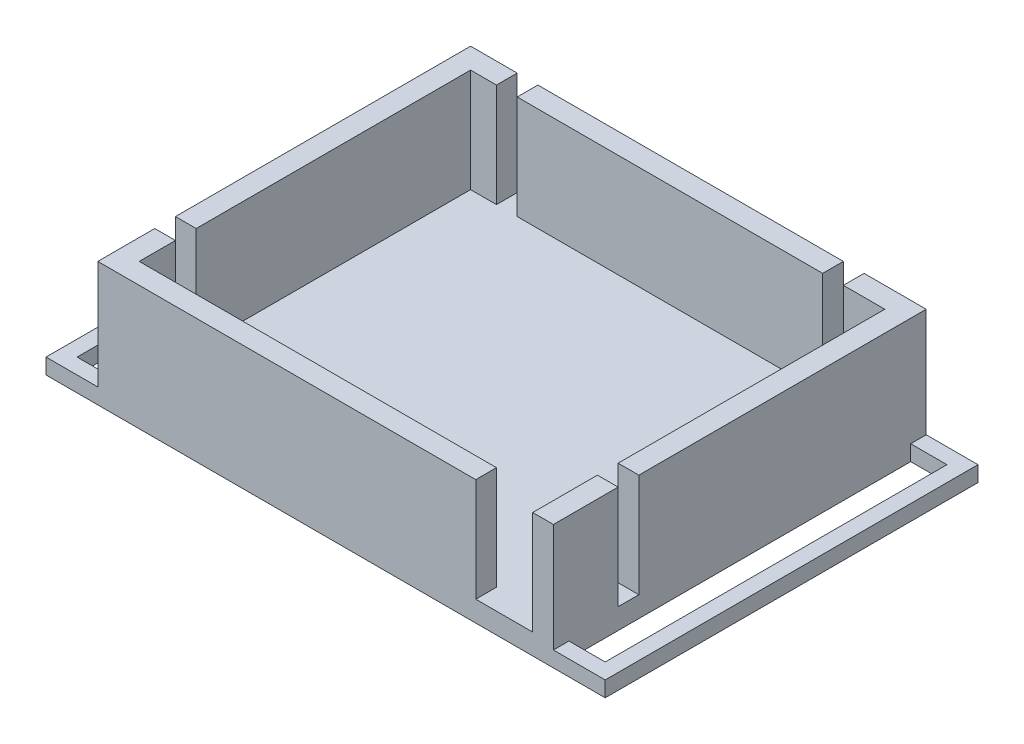
ISO-10303-21;
HEADER;
FILE_DESCRIPTION(('STEP AP214'),'2;1');
FILE_NAME('part.step','',(''),(''),'','','');
FILE_SCHEMA(('AUTOMOTIVE_DESIGN { 1 0 10303 214 1 1 1 1 }'));
ENDSEC;
DATA;
#1=APPLICATION_CONTEXT('core data for automotive mechanical design processes');
#2=APPLICATION_PROTOCOL_DEFINITION('international standard','automotive_design',2000,#1);
#3=PRODUCT_CONTEXT('',#1,'mechanical');
#4=PRODUCT('Part','Part','',(#3));
#5=PRODUCT_RELATED_PRODUCT_CATEGORY('part','',(#4));
#6=PRODUCT_DEFINITION_FORMATION('','',#4);
#7=PRODUCT_DEFINITION_CONTEXT('part definition',#1,'design');
#8=PRODUCT_DEFINITION('design','',#6,#7);
#9=PRODUCT_DEFINITION_SHAPE('','',#8);
#10=(LENGTH_UNIT() NAMED_UNIT(*) SI_UNIT(.MILLI.,.METRE.));
#11=(NAMED_UNIT(*) PLANE_ANGLE_UNIT() SI_UNIT($,.RADIAN.));
#12=(NAMED_UNIT(*) SI_UNIT($,.STERADIAN.) SOLID_ANGLE_UNIT());
#13=UNCERTAINTY_MEASURE_WITH_UNIT(LENGTH_MEASURE(1.E-05),#10,'distance_accuracy_value','');
#14=(GEOMETRIC_REPRESENTATION_CONTEXT(3) GLOBAL_UNCERTAINTY_ASSIGNED_CONTEXT((#13)) GLOBAL_UNIT_ASSIGNED_CONTEXT((#10,
#11,#12)) REPRESENTATION_CONTEXT('',''));
#15=CARTESIAN_POINT('',(0.,0.,0.));
#16=DIRECTION('',(0.,0.,1.));
#17=DIRECTION('',(1.,0.,0.));
#18=AXIS2_PLACEMENT_3D('',#15,#16,#17);
#19=CARTESIAN_POINT('',(44.,20.,-32.));
#20=DIRECTION('',(-1.,0.,0.));
#21=DIRECTION('',(0.,0.,1.));
#22=AXIS2_PLACEMENT_3D('',#19,#20,#21);
#23=PLANE('',#22);
#24=DIRECTION('',(0.,0.,1.));
#25=VECTOR('',#24,1.);
#26=CARTESIAN_POINT('',(44.,-1.,36.));
#27=LINE('',#26,#25);
#28=CARTESIAN_POINT('',(44.,-1.,-36.));
#29=VERTEX_POINT('',#28);
#30=CARTESIAN_POINT('',(44.,-1.,-33.));
#31=VERTEX_POINT('',#30);
#32=EDGE_CURVE('E384',#29,#31,#27,.T.);
#33=ORIENTED_EDGE('',*,*,#32,.F.);
#34=DIRECTION('',(0.,-1.,0.));
#35=VECTOR('',#34,1.);
#36=CARTESIAN_POINT('',(44.,20.,-36.));
#37=LINE('',#36,#35);
#38=CARTESIAN_POINT('',(44.,20.,-36.));
#39=VERTEX_POINT('',#38);
#40=EDGE_CURVE('E11',#39,#29,#37,.T.);
#41=ORIENTED_EDGE('',*,*,#40,.F.);
#42=DIRECTION('',(0.,0.,-1.));
#43=VECTOR('',#42,1.);
#44=CARTESIAN_POINT('',(44.,20.,-32.));
#45=LINE('',#44,#43);
#46=CARTESIAN_POINT('',(44.,20.,19.5));
#47=VERTEX_POINT('',#46);
#48=EDGE_CURVE('E648',#47,#39,#45,.T.);
#49=ORIENTED_EDGE('',*,*,#48,.F.);
#50=DIRECTION('',(0.,1.,0.));
#51=VECTOR('',#50,1.);
#52=CARTESIAN_POINT('',(44.,0.,19.5));
#53=LINE('',#52,#51);
#54=CARTESIAN_POINT('',(44.,0.,19.5));
#55=VERTEX_POINT('',#54);
#56=EDGE_CURVE('E433',#55,#47,#53,.T.);
#57=ORIENTED_EDGE('',*,*,#56,.F.);
#58=DIRECTION('',(0.,0.,-1.));
#59=VECTOR('',#58,1.);
#60=CARTESIAN_POINT('',(44.,0.,23.5));
#61=LINE('',#60,#59);
#62=CARTESIAN_POINT('',(44.,0.,23.5));
#63=VERTEX_POINT('',#62);
#64=EDGE_CURVE('E461',#63,#55,#61,.T.);
#65=ORIENTED_EDGE('',*,*,#64,.F.);
#66=DIRECTION('',(0.,1.,0.));
#67=VECTOR('',#66,1.);
#68=CARTESIAN_POINT('',(44.,0.,23.5));
#69=LINE('',#68,#67);
#70=CARTESIAN_POINT('',(44.,20.,23.5));
#71=VERTEX_POINT('',#70);
#72=EDGE_CURVE('E436',#63,#71,#69,.T.);
#73=ORIENTED_EDGE('',*,*,#72,.T.);
#74=CARTESIAN_POINT('',(44.,20.,36.));
#75=VERTEX_POINT('',#74);
#76=EDGE_CURVE('E649',#75,#71,#45,.T.);
#77=ORIENTED_EDGE('',*,*,#76,.F.);
#78=DIRECTION('',(0.,-1.,0.));
#79=VECTOR('',#78,1.);
#80=CARTESIAN_POINT('',(44.,20.,36.));
#81=LINE('',#80,#79);
#82=CARTESIAN_POINT('',(44.,-1.,36.));
#83=VERTEX_POINT('',#82);
#84=EDGE_CURVE('E633',#75,#83,#81,.T.);
#85=ORIENTED_EDGE('',*,*,#84,.T.);
#86=CARTESIAN_POINT('',(44.,-1.,33.));
#87=VERTEX_POINT('',#86);
#88=EDGE_CURVE('E336',#87,#83,#27,.T.);
#89=ORIENTED_EDGE('',*,*,#88,.F.);
#90=DIRECTION('',(0.,1.,0.));
#91=VECTOR('',#90,1.);
#92=CARTESIAN_POINT('',(44.,-3.99999999999999,33.));
#93=LINE('',#92,#91);
#94=CARTESIAN_POINT('',(44.,-3.99999999999999,33.));
#95=VERTEX_POINT('',#94);
#96=EDGE_CURVE('E342',#95,#87,#93,.T.);
#97=ORIENTED_EDGE('',*,*,#96,.F.);
#98=DIRECTION('',(0.,0.,1.));
#99=VECTOR('',#98,1.);
#100=CARTESIAN_POINT('',(44.,-4.,-33.));
#101=LINE('',#100,#99);
#102=CARTESIAN_POINT('',(44.,-4.,-33.));
#103=VERTEX_POINT('',#102);
#104=EDGE_CURVE('E360',#103,#95,#101,.T.);
#105=ORIENTED_EDGE('',*,*,#104,.F.);
#106=DIRECTION('',(0.,1.,0.));
#107=VECTOR('',#106,1.);
#108=CARTESIAN_POINT('',(44.,-4.,-33.));
#109=LINE('',#108,#107);
#110=EDGE_CURVE('E352',#103,#31,#109,.T.);
#111=ORIENTED_EDGE('',*,*,#110,.T.);
#112=EDGE_LOOP('',(#33,#41,#49,#57,#65,#73,#77,#85,#89,#97,#105,#111));
#113=FACE_BOUND('',#112,.T.);
#114=ADVANCED_FACE('F43',(#113),#23,.F.);
#115=CARTESIAN_POINT('',(-44.,20.,-32.));
#116=DIRECTION('',(1.,0.,0.));
#117=DIRECTION('',(0.,0.,-1.));
#118=AXIS2_PLACEMENT_3D('',#115,#116,#117);
#119=PLANE('',#118);
#120=DIRECTION('',(0.,0.,-1.));
#121=VECTOR('',#120,1.);
#122=CARTESIAN_POINT('',(-44.,-0.99999999999999,36.));
#123=LINE('',#122,#121);
#124=CARTESIAN_POINT('',(-44.,-0.999999999999994,36.));
#125=VERTEX_POINT('',#124);
#126=CARTESIAN_POINT('',(-44.,-0.999999999999991,33.));
#127=VERTEX_POINT('',#126);
#128=EDGE_CURVE('E410',#125,#127,#123,.T.);
#129=ORIENTED_EDGE('',*,*,#128,.F.);
#130=DIRECTION('',(0.,-1.,0.));
#131=VECTOR('',#130,1.);
#132=CARTESIAN_POINT('',(-44.,20.,36.));
#133=LINE('',#132,#131);
#134=CARTESIAN_POINT('',(-44.,20.,36.));
#135=VERTEX_POINT('',#134);
#136=EDGE_CURVE('E637',#135,#125,#133,.T.);
#137=ORIENTED_EDGE('',*,*,#136,.F.);
#138=DIRECTION('',(0.,0.,1.));
#139=VECTOR('',#138,1.);
#140=CARTESIAN_POINT('',(-44.,20.,-32.));
#141=LINE('',#140,#139);
#142=CARTESIAN_POINT('',(-44.,20.,25.));
#143=VERTEX_POINT('',#142);
#144=EDGE_CURVE('E657',#143,#135,#141,.T.);
#145=ORIENTED_EDGE('',*,*,#144,.F.);
#146=DIRECTION('',(0.,1.,0.));
#147=VECTOR('',#146,1.);
#148=CARTESIAN_POINT('',(-44.,0.,25.));
#149=LINE('',#148,#147);
#150=CARTESIAN_POINT('',(-44.,0.,25.));
#151=VERTEX_POINT('',#150);
#152=EDGE_CURVE('E487',#151,#143,#149,.T.);
#153=ORIENTED_EDGE('',*,*,#152,.F.);
#154=DIRECTION('',(0.,0.,1.));
#155=VECTOR('',#154,1.);
#156=CARTESIAN_POINT('',(-44.,0.,21.));
#157=LINE('',#156,#155);
#158=CARTESIAN_POINT('',(-44.,0.,21.));
#159=VERTEX_POINT('',#158);
#160=EDGE_CURVE('E515',#159,#151,#157,.T.);
#161=ORIENTED_EDGE('',*,*,#160,.F.);
#162=DIRECTION('',(0.,1.,0.));
#163=VECTOR('',#162,1.);
#164=CARTESIAN_POINT('',(-44.,0.,21.));
#165=LINE('',#164,#163);
#166=CARTESIAN_POINT('',(-44.,20.,21.));
#167=VERTEX_POINT('',#166);
#168=EDGE_CURVE('E490',#159,#167,#165,.T.);
#169=ORIENTED_EDGE('',*,*,#168,.T.);
#170=CARTESIAN_POINT('',(-44.,20.,-36.));
#171=VERTEX_POINT('',#170);
#172=EDGE_CURVE('E659',#171,#167,#141,.T.);
#173=ORIENTED_EDGE('',*,*,#172,.F.);
#174=DIRECTION('',(0.,-1.,0.));
#175=VECTOR('',#174,1.);
#176=CARTESIAN_POINT('',(-44.,20.,-36.));
#177=LINE('',#176,#175);
#178=CARTESIAN_POINT('',(-44.,-1.,-36.));
#179=VERTEX_POINT('',#178);
#180=EDGE_CURVE('E53',#171,#179,#177,.T.);
#181=ORIENTED_EDGE('',*,*,#180,.T.);
#182=CARTESIAN_POINT('',(-44.,-1.,-33.));
#183=VERTEX_POINT('',#182);
#184=EDGE_CURVE('E298',#183,#179,#123,.T.);
#185=ORIENTED_EDGE('',*,*,#184,.F.);
#186=DIRECTION('',(0.,1.,0.));
#187=VECTOR('',#186,1.);
#188=CARTESIAN_POINT('',(-44.,-4.,-33.));
#189=LINE('',#188,#187);
#190=CARTESIAN_POINT('',(-44.,-4.,-33.));
#191=VERTEX_POINT('',#190);
#192=EDGE_CURVE('E291',#191,#183,#189,.T.);
#193=ORIENTED_EDGE('',*,*,#192,.F.);
#194=DIRECTION('',(0.,0.,-1.));
#195=VECTOR('',#194,1.);
#196=CARTESIAN_POINT('',(-44.,-4.,-33.));
#197=LINE('',#196,#195);
#198=CARTESIAN_POINT('',(-44.,-3.99999999999999,33.));
#199=VERTEX_POINT('',#198);
#200=EDGE_CURVE('E295',#199,#191,#197,.T.);
#201=ORIENTED_EDGE('',*,*,#200,.F.);
#202=DIRECTION('',(0.,1.,0.));
#203=VECTOR('',#202,1.);
#204=CARTESIAN_POINT('',(-44.,-3.99999999999999,33.));
#205=LINE('',#204,#203);
#206=EDGE_CURVE('E333',#199,#127,#205,.T.);
#207=ORIENTED_EDGE('',*,*,#206,.T.);
#208=EDGE_LOOP('',(#129,#137,#145,#153,#161,#169,#173,#181,#185,#193,#201,#207));
#209=FACE_BOUND('',#208,.T.);
#210=ADVANCED_FACE('F293',(#209),#119,.F.);
#211=CARTESIAN_POINT('',(0.,20.,0.));
#212=DIRECTION('',(0.,1.,0.));
#213=DIRECTION('',(0.,0.,1.));
#214=AXIS2_PLACEMENT_3D('',#211,#212,#213);
#215=PLANE('',#214);
#216=DIRECTION('',(0.,0.,1.));
#217=VECTOR('',#216,1.);
#218=CARTESIAN_POINT('',(-40.,20.,-32.));
#219=LINE('',#218,#217);
#220=CARTESIAN_POINT('',(-40.,20.,25.));
#221=VERTEX_POINT('',#220);
#222=CARTESIAN_POINT('',(-40.,20.,32.));
#223=VERTEX_POINT('',#222);
#224=EDGE_CURVE('E591',#221,#223,#219,.T.);
#225=ORIENTED_EDGE('',*,*,#224,.F.);
#226=DIRECTION('',(-1.,0.,0.));
#227=VECTOR('',#226,1.);
#228=CARTESIAN_POINT('',(-40.,20.,25.));
#229=LINE('',#228,#227);
#230=EDGE_CURVE('E506',#221,#143,#229,.T.);
#231=ORIENTED_EDGE('',*,*,#230,.T.);
#232=ORIENTED_EDGE('',*,*,#144,.T.);
#233=DIRECTION('',(1.,0.,0.));
#234=VECTOR('',#233,1.);
#235=CARTESIAN_POINT('',(-40.,20.,36.));
#236=LINE('',#235,#234);
#237=CARTESIAN_POINT('',(29.,20.,36.));
#238=VERTEX_POINT('',#237);
#239=EDGE_CURVE('E47',#135,#238,#236,.T.);
#240=ORIENTED_EDGE('',*,*,#239,.T.);
#241=DIRECTION('',(0.,0.,1.));
#242=VECTOR('',#241,1.);
#243=CARTESIAN_POINT('',(29.,20.,32.));
#244=LINE('',#243,#242);
#245=CARTESIAN_POINT('',(29.,20.,32.));
#246=VERTEX_POINT('',#245);
#247=EDGE_CURVE('E437',#246,#238,#244,.T.);
#248=ORIENTED_EDGE('',*,*,#247,.F.);
#249=DIRECTION('',(1.,0.,0.));
#250=VECTOR('',#249,1.);
#251=CARTESIAN_POINT('',(-40.,20.,32.));
#252=LINE('',#251,#250);
#253=EDGE_CURVE('E597',#223,#246,#252,.T.);
#254=ORIENTED_EDGE('',*,*,#253,.F.);
#255=EDGE_LOOP('',(#225,#231,#232,#240,#248,#254));
#256=FACE_BOUND('',#255,.T.);
#257=ADVANCED_FACE('F673',(#256),#215,.T.);
#258=DIRECTION('',(-1.,0.,0.));
#259=VECTOR('',#258,1.);
#260=CARTESIAN_POINT('',(-40.,20.,-36.));
#261=LINE('',#260,#259);
#262=CARTESIAN_POINT('',(32.,20.,-36.));
#263=VERTEX_POINT('',#262);
#264=EDGE_CURVE('E654',#39,#263,#261,.T.);
#265=ORIENTED_EDGE('',*,*,#264,.T.);
#266=DIRECTION('',(0.,0.,1.));
#267=VECTOR('',#266,1.);
#268=CARTESIAN_POINT('',(32.,20.,-36.));
#269=LINE('',#268,#267);
#270=CARTESIAN_POINT('',(32.,20.,-32.));
#271=VERTEX_POINT('',#270);
#272=EDGE_CURVE('E535',#263,#271,#269,.T.);
#273=ORIENTED_EDGE('',*,*,#272,.T.);
#274=DIRECTION('',(-1.,0.,0.));
#275=VECTOR('',#274,1.);
#276=CARTESIAN_POINT('',(-40.,20.,-32.));
#277=LINE('',#276,#275);
#278=CARTESIAN_POINT('',(40.,20.,-32.));
#279=VERTEX_POINT('',#278);
#280=EDGE_CURVE('E587',#279,#271,#277,.T.);
#281=ORIENTED_EDGE('',*,*,#280,.F.);
#282=DIRECTION('',(0.,0.,-1.));
#283=VECTOR('',#282,1.);
#284=CARTESIAN_POINT('',(40.,20.,-32.));
#285=LINE('',#284,#283);
#286=CARTESIAN_POINT('',(40.,20.,19.5));
#287=VERTEX_POINT('',#286);
#288=EDGE_CURVE('E586',#287,#279,#285,.T.);
#289=ORIENTED_EDGE('',*,*,#288,.F.);
#290=DIRECTION('',(1.,0.,0.));
#291=VECTOR('',#290,1.);
#292=CARTESIAN_POINT('',(40.,20.,19.5));
#293=LINE('',#292,#291);
#294=EDGE_CURVE('E452',#287,#47,#293,.T.);
#295=ORIENTED_EDGE('',*,*,#294,.T.);
#296=ORIENTED_EDGE('',*,*,#48,.T.);
#297=EDGE_LOOP('',(#265,#273,#281,#289,#295,#296));
#298=FACE_BOUND('',#297,.T.);
#299=ADVANCED_FACE('F791',(#298),#215,.T.);
#300=DIRECTION('',(0.,0.,1.));
#301=VECTOR('',#300,1.);
#302=CARTESIAN_POINT('',(28.,20.,-36.));
#303=LINE('',#302,#301);
#304=CARTESIAN_POINT('',(28.,20.,-36.));
#305=VERTEX_POINT('',#304);
#306=CARTESIAN_POINT('',(28.,20.,-32.));
#307=VERTEX_POINT('',#306);
#308=EDGE_CURVE('E491',#305,#307,#303,.T.);
#309=ORIENTED_EDGE('',*,*,#308,.F.);
#310=CARTESIAN_POINT('',(-31.,20.,-36.));
#311=VERTEX_POINT('',#310);
#312=EDGE_CURVE('E658',#305,#311,#261,.T.);
#313=ORIENTED_EDGE('',*,*,#312,.T.);
#314=DIRECTION('',(0.,0.,1.));
#315=VECTOR('',#314,1.);
#316=CARTESIAN_POINT('',(-31.,20.,-36.));
#317=LINE('',#316,#315);
#318=CARTESIAN_POINT('',(-31.,20.,-32.));
#319=VERTEX_POINT('',#318);
#320=EDGE_CURVE('E554',#311,#319,#317,.T.);
#321=ORIENTED_EDGE('',*,*,#320,.T.);
#322=EDGE_CURVE('E592',#307,#319,#277,.T.);
#323=ORIENTED_EDGE('',*,*,#322,.F.);
#324=EDGE_LOOP('',(#309,#313,#321,#323));
#325=FACE_BOUND('',#324,.T.);
#326=ADVANCED_FACE('F785',(#325),#215,.T.);
#327=DIRECTION('',(1.,0.,0.));
#328=VECTOR('',#327,1.);
#329=CARTESIAN_POINT('',(40.,20.,23.5));
#330=LINE('',#329,#328);
#331=CARTESIAN_POINT('',(40.,20.,23.5));
#332=VERTEX_POINT('',#331);
#333=EDGE_CURVE('E449',#332,#71,#330,.T.);
#334=ORIENTED_EDGE('',*,*,#333,.F.);
#335=CARTESIAN_POINT('',(40.,20.,36.));
#336=VERTEX_POINT('',#335);
#337=EDGE_CURVE('E581',#336,#332,#285,.T.);
#338=ORIENTED_EDGE('',*,*,#337,.F.);
#339=EDGE_CURVE('E662',#336,#75,#236,.T.);
#340=ORIENTED_EDGE('',*,*,#339,.T.);
#341=ORIENTED_EDGE('',*,*,#76,.T.);
#342=EDGE_LOOP('',(#334,#338,#340,#341));
#343=FACE_BOUND('',#342,.T.);
#344=ADVANCED_FACE('F839',(#343),#215,.T.);
#345=CARTESIAN_POINT('',(40.,20.,-32.));
#346=DIRECTION('',(-1.,0.,0.));
#347=DIRECTION('',(0.,0.,1.));
#348=AXIS2_PLACEMENT_3D('',#345,#346,#347);
#349=PLANE('',#348);
#350=DIRECTION('',(0.,0.,-1.));
#351=VECTOR('',#350,1.);
#352=CARTESIAN_POINT('',(40.,0.,-32.));
#353=LINE('',#352,#351);
#354=CARTESIAN_POINT('',(40.,0.,19.5));
#355=VERTEX_POINT('',#354);
#356=CARTESIAN_POINT('',(40.,0.,-32.));
#357=VERTEX_POINT('',#356);
#358=EDGE_CURVE('E580',#355,#357,#353,.T.);
#359=ORIENTED_EDGE('',*,*,#358,.F.);
#360=DIRECTION('',(0.,1.,0.));
#361=VECTOR('',#360,1.);
#362=CARTESIAN_POINT('',(40.,0.,19.5));
#363=LINE('',#362,#361);
#364=EDGE_CURVE('E444',#355,#287,#363,.T.);
#365=ORIENTED_EDGE('',*,*,#364,.T.);
#366=ORIENTED_EDGE('',*,*,#288,.T.);
#367=DIRECTION('',(0.,-1.,0.));
#368=VECTOR('',#367,1.);
#369=CARTESIAN_POINT('',(40.,20.,-32.));
#370=LINE('',#369,#368);
#371=EDGE_CURVE('E628',#279,#357,#370,.T.);
#372=ORIENTED_EDGE('',*,*,#371,.T.);
#373=EDGE_LOOP('',(#359,#365,#366,#372));
#374=FACE_BOUND('',#373,.T.);
#375=ADVANCED_FACE('F799',(#374),#349,.T.);
#376=CARTESIAN_POINT('',(-40.,20.,-32.));
#377=DIRECTION('',(0.,0.,1.));
#378=DIRECTION('',(1.,0.,0.));
#379=AXIS2_PLACEMENT_3D('',#376,#377,#378);
#380=PLANE('',#379);
#381=ORIENTED_EDGE('',*,*,#280,.T.);
#382=DIRECTION('',(0.,1.,0.));
#383=VECTOR('',#382,1.);
#384=CARTESIAN_POINT('',(32.,0.,-32.));
#385=LINE('',#384,#383);
#386=CARTESIAN_POINT('',(32.,0.,-32.));
#387=VERTEX_POINT('',#386);
#388=EDGE_CURVE('E531',#387,#271,#385,.T.);
#389=ORIENTED_EDGE('',*,*,#388,.F.);
#390=DIRECTION('',(-1.,0.,0.));
#391=VECTOR('',#390,1.);
#392=CARTESIAN_POINT('',(-40.,0.,-32.));
#393=LINE('',#392,#391);
#394=EDGE_CURVE('E607',#357,#387,#393,.T.);
#395=ORIENTED_EDGE('',*,*,#394,.F.);
#396=ORIENTED_EDGE('',*,*,#371,.F.);
#397=EDGE_LOOP('',(#381,#389,#395,#396));
#398=FACE_BOUND('',#397,.T.);
#399=ADVANCED_FACE('F805',(#398),#380,.T.);
#400=DIRECTION('',(0.,1.,0.));
#401=VECTOR('',#400,1.);
#402=CARTESIAN_POINT('',(28.,0.,-32.));
#403=LINE('',#402,#401);
#404=CARTESIAN_POINT('',(28.,0.,-32.));
#405=VERTEX_POINT('',#404);
#406=EDGE_CURVE('E457',#405,#307,#403,.T.);
#407=ORIENTED_EDGE('',*,*,#406,.T.);
#408=ORIENTED_EDGE('',*,*,#322,.T.);
#409=DIRECTION('',(0.,1.,0.));
#410=VECTOR('',#409,1.);
#411=CARTESIAN_POINT('',(-31.,0.,-32.));
#412=LINE('',#411,#410);
#413=CARTESIAN_POINT('',(-31.,0.,-32.));
#414=VERTEX_POINT('',#413);
#415=EDGE_CURVE('E561',#414,#319,#412,.T.);
#416=ORIENTED_EDGE('',*,*,#415,.F.);
#417=EDGE_CURVE('E612',#405,#414,#393,.T.);
#418=ORIENTED_EDGE('',*,*,#417,.F.);
#419=EDGE_LOOP('',(#407,#408,#416,#418));
#420=FACE_BOUND('',#419,.T.);
#421=ADVANCED_FACE('F780',(#420),#380,.T.);
#422=CARTESIAN_POINT('',(-40.,20.,-32.));
#423=DIRECTION('',(1.,0.,0.));
#424=DIRECTION('',(0.,0.,-1.));
#425=AXIS2_PLACEMENT_3D('',#422,#423,#424);
#426=PLANE('',#425);
#427=DIRECTION('',(0.,0.,1.));
#428=VECTOR('',#427,1.);
#429=CARTESIAN_POINT('',(-40.,0.,-32.));
#430=LINE('',#429,#428);
#431=CARTESIAN_POINT('',(-40.,0.,25.));
#432=VERTEX_POINT('',#431);
#433=CARTESIAN_POINT('',(-40.,0.,32.));
#434=VERTEX_POINT('',#433);
#435=EDGE_CURVE('E611',#432,#434,#430,.T.);
#436=ORIENTED_EDGE('',*,*,#435,.F.);
#437=DIRECTION('',(0.,1.,0.));
#438=VECTOR('',#437,1.);
#439=CARTESIAN_POINT('',(-40.,0.,25.));
#440=LINE('',#439,#438);
#441=EDGE_CURVE('E498',#432,#221,#440,.T.);
#442=ORIENTED_EDGE('',*,*,#441,.T.);
#443=ORIENTED_EDGE('',*,*,#224,.T.);
#444=DIRECTION('',(0.,-1.,0.));
#445=VECTOR('',#444,1.);
#446=CARTESIAN_POINT('',(-40.,20.,32.));
#447=LINE('',#446,#445);
#448=EDGE_CURVE('E601',#223,#434,#447,.T.);
#449=ORIENTED_EDGE('',*,*,#448,.T.);
#450=EDGE_LOOP('',(#436,#442,#443,#449));
#451=FACE_BOUND('',#450,.T.);
#452=ADVANCED_FACE('F834',(#451),#426,.T.);
#453=CARTESIAN_POINT('',(-40.,20.,-36.));
#454=DIRECTION('',(0.,0.,1.));
#455=DIRECTION('',(1.,0.,0.));
#456=AXIS2_PLACEMENT_3D('',#453,#454,#455);
#457=PLANE('',#456);
#458=ORIENTED_EDGE('',*,*,#312,.F.);
#459=DIRECTION('',(0.,1.,0.));
#460=VECTOR('',#459,1.);
#461=CARTESIAN_POINT('',(28.,0.,-36.));
#462=LINE('',#461,#460);
#463=CARTESIAN_POINT('',(28.,0.,-36.));
#464=VERTEX_POINT('',#463);
#465=EDGE_CURVE('E524',#464,#305,#462,.T.);
#466=ORIENTED_EDGE('',*,*,#465,.F.);
#467=DIRECTION('',(-1.,0.,0.));
#468=VECTOR('',#467,1.);
#469=CARTESIAN_POINT('',(32.,0.,-36.));
#470=LINE('',#469,#468);
#471=CARTESIAN_POINT('',(32.,0.,-36.));
#472=VERTEX_POINT('',#471);
#473=EDGE_CURVE('E544',#472,#464,#470,.T.);
#474=ORIENTED_EDGE('',*,*,#473,.F.);
#475=DIRECTION('',(0.,1.,0.));
#476=VECTOR('',#475,1.);
#477=CARTESIAN_POINT('',(32.,0.,-36.));
#478=LINE('',#477,#476);
#479=EDGE_CURVE('E527',#472,#263,#478,.T.);
#480=ORIENTED_EDGE('',*,*,#479,.T.);
#481=ORIENTED_EDGE('',*,*,#264,.F.);
#482=ORIENTED_EDGE('',*,*,#40,.T.);
#483=DIRECTION('',(-1.,0.,0.));
#484=VECTOR('',#483,1.);
#485=CARTESIAN_POINT('',(54.,-1.,-36.));
#486=LINE('',#485,#484);
#487=CARTESIAN_POINT('',(54.,-1.,-36.));
#488=VERTEX_POINT('',#487);
#489=EDGE_CURVE('E401',#488,#29,#486,.T.);
#490=ORIENTED_EDGE('',*,*,#489,.F.);
#491=DIRECTION('',(0.,1.,0.));
#492=VECTOR('',#491,1.);
#493=CARTESIAN_POINT('',(54.,-4.,-36.));
#494=LINE('',#493,#492);
#495=CARTESIAN_POINT('',(54.,-4.,-36.));
#496=VERTEX_POINT('',#495);
#497=EDGE_CURVE('E388',#496,#488,#494,.T.);
#498=ORIENTED_EDGE('',*,*,#497,.F.);
#499=DIRECTION('',(-1.,0.,0.));
#500=VECTOR('',#499,1.);
#501=CARTESIAN_POINT('',(-40.,-4.,-36.));
#502=LINE('',#501,#500);
#503=CARTESIAN_POINT('',(-54.,-4.,-36.));
#504=VERTEX_POINT('',#503);
#505=EDGE_CURVE('E631',#496,#504,#502,.T.);
#506=ORIENTED_EDGE('',*,*,#505,.T.);
#507=DIRECTION('',(0.,-1.,0.));
#508=VECTOR('',#507,1.);
#509=CARTESIAN_POINT('',(-54.,-1.,-36.));
#510=LINE('',#509,#508);
#511=CARTESIAN_POINT('',(-54.,-1.,-36.));
#512=VERTEX_POINT('',#511);
#513=EDGE_CURVE('E413',#512,#504,#510,.T.);
#514=ORIENTED_EDGE('',*,*,#513,.F.);
#515=DIRECTION('',(1.,0.,0.));
#516=VECTOR('',#515,1.);
#517=CARTESIAN_POINT('',(-54.,-1.,-36.));
#518=LINE('',#517,#516);
#519=EDGE_CURVE('E421',#512,#179,#518,.T.);
#520=ORIENTED_EDGE('',*,*,#519,.T.);
#521=ORIENTED_EDGE('',*,*,#180,.F.);
#522=CARTESIAN_POINT('',(-35.,20.,-36.));
#523=VERTEX_POINT('',#522);
#524=EDGE_CURVE('E653',#523,#171,#261,.T.);
#525=ORIENTED_EDGE('',*,*,#524,.F.);
#526=DIRECTION('',(0.,1.,0.));
#527=VECTOR('',#526,1.);
#528=CARTESIAN_POINT('',(-35.,0.,-36.));
#529=LINE('',#528,#527);
#530=CARTESIAN_POINT('',(-35.,0.,-36.));
#531=VERTEX_POINT('',#530);
#532=EDGE_CURVE('E573',#531,#523,#529,.T.);
#533=ORIENTED_EDGE('',*,*,#532,.F.);
#534=DIRECTION('',(-1.,0.,0.));
#535=VECTOR('',#534,1.);
#536=CARTESIAN_POINT('',(-31.,0.,-36.));
#537=LINE('',#536,#535);
#538=CARTESIAN_POINT('',(-31.,0.,-36.));
#539=VERTEX_POINT('',#538);
#540=EDGE_CURVE('E553',#539,#531,#537,.T.);
#541=ORIENTED_EDGE('',*,*,#540,.F.);
#542=DIRECTION('',(0.,1.,0.));
#543=VECTOR('',#542,1.);
#544=CARTESIAN_POINT('',(-31.,0.,-36.));
#545=LINE('',#544,#543);
#546=EDGE_CURVE('E569',#539,#311,#545,.T.);
#547=ORIENTED_EDGE('',*,*,#546,.T.);
#548=EDGE_LOOP('',(#458,#466,#474,#480,#481,#482,#490,#498,#506,#514,#520,#521,#525,#533,#541,#547));
#549=FACE_BOUND('',#548,.T.);
#550=ADVANCED_FACE('F728',(#549),#457,.F.);
#551=CARTESIAN_POINT('',(-40.,20.,36.));
#552=DIRECTION('',(0.,0.,-1.));
#553=DIRECTION('',(-1.,0.,0.));
#554=AXIS2_PLACEMENT_3D('',#551,#552,#553);
#555=PLANE('',#554);
#556=DIRECTION('',(-1.,0.,0.));
#557=VECTOR('',#556,1.);
#558=CARTESIAN_POINT('',(40.,0.,36.));
#559=LINE('',#558,#557);
#560=CARTESIAN_POINT('',(40.,0.,36.));
#561=VERTEX_POINT('',#560);
#562=CARTESIAN_POINT('',(29.,0.,36.));
#563=VERTEX_POINT('',#562);
#564=EDGE_CURVE('E480',#561,#563,#559,.T.);
#565=ORIENTED_EDGE('',*,*,#564,.T.);
#566=DIRECTION('',(0.,1.,0.));
#567=VECTOR('',#566,1.);
#568=CARTESIAN_POINT('',(29.,0.,36.));
#569=LINE('',#568,#567);
#570=EDGE_CURVE('E432',#563,#238,#569,.T.);
#571=ORIENTED_EDGE('',*,*,#570,.T.);
#572=ORIENTED_EDGE('',*,*,#239,.F.);
#573=ORIENTED_EDGE('',*,*,#136,.T.);
#574=DIRECTION('',(1.,0.,0.));
#575=VECTOR('',#574,1.);
#576=CARTESIAN_POINT('',(-54.,-0.99999999999999,36.));
#577=LINE('',#576,#575);
#578=CARTESIAN_POINT('',(-54.,-0.99999999999999,36.));
#579=VERTEX_POINT('',#578);
#580=EDGE_CURVE('E428',#579,#125,#577,.T.);
#581=ORIENTED_EDGE('',*,*,#580,.F.);
#582=DIRECTION('',(0.,1.,0.));
#583=VECTOR('',#582,1.);
#584=CARTESIAN_POINT('',(-54.,-0.99999999999999,36.));
#585=LINE('',#584,#583);
#586=CARTESIAN_POINT('',(-54.,-4.,36.));
#587=VERTEX_POINT('',#586);
#588=EDGE_CURVE('E405',#587,#579,#585,.T.);
#589=ORIENTED_EDGE('',*,*,#588,.F.);
#590=DIRECTION('',(1.,0.,0.));
#591=VECTOR('',#590,1.);
#592=CARTESIAN_POINT('',(-40.,-4.,36.));
#593=LINE('',#592,#591);
#594=CARTESIAN_POINT('',(54.,-4.,36.));
#595=VERTEX_POINT('',#594);
#596=EDGE_CURVE('E640',#587,#595,#593,.T.);
#597=ORIENTED_EDGE('',*,*,#596,.T.);
#598=DIRECTION('',(0.,-1.,0.));
#599=VECTOR('',#598,1.);
#600=CARTESIAN_POINT('',(54.,-4.,36.));
#601=LINE('',#600,#599);
#602=CARTESIAN_POINT('',(54.,-1.,36.));
#603=VERTEX_POINT('',#602);
#604=EDGE_CURVE('E379',#603,#595,#601,.T.);
#605=ORIENTED_EDGE('',*,*,#604,.F.);
#606=DIRECTION('',(-1.,0.,0.));
#607=VECTOR('',#606,1.);
#608=CARTESIAN_POINT('',(54.,-1.,36.));
#609=LINE('',#608,#607);
#610=EDGE_CURVE('E394',#603,#83,#609,.T.);
#611=ORIENTED_EDGE('',*,*,#610,.T.);
#612=ORIENTED_EDGE('',*,*,#84,.F.);
#613=ORIENTED_EDGE('',*,*,#339,.F.);
#614=DIRECTION('',(0.,1.,0.));
#615=VECTOR('',#614,1.);
#616=CARTESIAN_POINT('',(40.,0.,36.));
#617=LINE('',#616,#615);
#618=EDGE_CURVE('E473',#561,#336,#617,.T.);
#619=ORIENTED_EDGE('',*,*,#618,.F.);
#620=EDGE_LOOP('',(#565,#571,#572,#573,#581,#589,#597,#605,#611,#612,#613,#619));
#621=FACE_BOUND('',#620,.T.);
#622=ADVANCED_FACE('F679',(#621),#555,.F.);
#623=DIRECTION('',(-1.,0.,0.));
#624=VECTOR('',#623,1.);
#625=CARTESIAN_POINT('',(-40.,20.,21.));
#626=LINE('',#625,#624);
#627=CARTESIAN_POINT('',(-40.,20.,21.));
#628=VERTEX_POINT('',#627);
#629=EDGE_CURVE('E503',#628,#167,#626,.T.);
#630=ORIENTED_EDGE('',*,*,#629,.F.);
#631=CARTESIAN_POINT('',(-40.,20.,-32.));
#632=VERTEX_POINT('',#631);
#633=EDGE_CURVE('E593',#632,#628,#219,.T.);
#634=ORIENTED_EDGE('',*,*,#633,.F.);
#635=CARTESIAN_POINT('',(-35.,20.,-32.));
#636=VERTEX_POINT('',#635);
#637=EDGE_CURVE('E585',#636,#632,#277,.T.);
#638=ORIENTED_EDGE('',*,*,#637,.F.);
#639=DIRECTION('',(0.,0.,1.));
#640=VECTOR('',#639,1.);
#641=CARTESIAN_POINT('',(-35.,20.,-36.));
#642=LINE('',#641,#640);
#643=EDGE_CURVE('E511',#523,#636,#642,.T.);
#644=ORIENTED_EDGE('',*,*,#643,.F.);
#645=ORIENTED_EDGE('',*,*,#524,.T.);
#646=ORIENTED_EDGE('',*,*,#172,.T.);
#647=EDGE_LOOP('',(#630,#634,#638,#644,#645,#646));
#648=FACE_BOUND('',#647,.T.);
#649=ADVANCED_FACE('F744',(#648),#215,.T.);
#650=CARTESIAN_POINT('',(0.,-4.,0.));
#651=DIRECTION('',(0.,1.,0.));
#652=DIRECTION('',(0.,0.,1.));
#653=AXIS2_PLACEMENT_3D('',#650,#651,#652);
#654=PLANE('',#653);
#655=DIRECTION('',(1.,0.,0.));
#656=VECTOR('',#655,1.);
#657=CARTESIAN_POINT('',(-44.,-3.99999999999999,33.));
#658=LINE('',#657,#656);
#659=CARTESIAN_POINT('',(-51.,-3.99999999999999,33.));
#660=VERTEX_POINT('',#659);
#661=EDGE_CURVE('E304',#660,#199,#658,.T.);
#662=ORIENTED_EDGE('',*,*,#661,.T.);
#663=ORIENTED_EDGE('',*,*,#200,.T.);
#664=DIRECTION('',(-1.,0.,0.));
#665=VECTOR('',#664,1.);
#666=CARTESIAN_POINT('',(-44.,-4.,-33.));
#667=LINE('',#666,#665);
#668=CARTESIAN_POINT('',(-51.,-4.,-33.));
#669=VERTEX_POINT('',#668);
#670=EDGE_CURVE('E307',#191,#669,#667,.T.);
#671=ORIENTED_EDGE('',*,*,#670,.T.);
#672=DIRECTION('',(0.,0.,1.));
#673=VECTOR('',#672,1.);
#674=CARTESIAN_POINT('',(-51.,-4.,-33.));
#675=LINE('',#674,#673);
#676=EDGE_CURVE('E61',#669,#660,#675,.T.);
#677=ORIENTED_EDGE('',*,*,#676,.T.);
#678=EDGE_LOOP('',(#662,#663,#671,#677));
#679=FACE_BOUND('',#678,.T.);
#680=DIRECTION('',(-1.,0.,0.));
#681=VECTOR('',#680,1.);
#682=CARTESIAN_POINT('',(44.,-4.,-33.));
#683=LINE('',#682,#681);
#684=CARTESIAN_POINT('',(51.,-4.,-33.));
#685=VERTEX_POINT('',#684);
#686=EDGE_CURVE('E345',#685,#103,#683,.T.);
#687=ORIENTED_EDGE('',*,*,#686,.T.);
#688=ORIENTED_EDGE('',*,*,#104,.T.);
#689=DIRECTION('',(1.,0.,0.));
#690=VECTOR('',#689,1.);
#691=CARTESIAN_POINT('',(44.,-3.99999999999999,33.));
#692=LINE('',#691,#690);
#693=CARTESIAN_POINT('',(51.,-4.,33.));
#694=VERTEX_POINT('',#693);
#695=EDGE_CURVE('E372',#95,#694,#692,.T.);
#696=ORIENTED_EDGE('',*,*,#695,.T.);
#697=DIRECTION('',(0.,0.,-1.));
#698=VECTOR('',#697,1.);
#699=CARTESIAN_POINT('',(51.,-4.,-33.));
#700=LINE('',#699,#698);
#701=EDGE_CURVE('E69',#694,#685,#700,.T.);
#702=ORIENTED_EDGE('',*,*,#701,.T.);
#703=EDGE_LOOP('',(#687,#688,#696,#702));
#704=FACE_BOUND('',#703,.T.);
#705=ORIENTED_EDGE('',*,*,#505,.F.);
#706=DIRECTION('',(0.,0.,-1.));
#707=VECTOR('',#706,1.);
#708=CARTESIAN_POINT('',(54.,-4.,36.));
#709=LINE('',#708,#707);
#710=EDGE_CURVE('E383',#595,#496,#709,.T.);
#711=ORIENTED_EDGE('',*,*,#710,.F.);
#712=ORIENTED_EDGE('',*,*,#596,.F.);
#713=DIRECTION('',(0.,0.,1.));
#714=VECTOR('',#713,1.);
#715=CARTESIAN_POINT('',(-54.,-4.,36.));
#716=LINE('',#715,#714);
#717=EDGE_CURVE('E417',#504,#587,#716,.T.);
#718=ORIENTED_EDGE('',*,*,#717,.F.);
#719=EDGE_LOOP('',(#705,#711,#712,#718));
#720=FACE_BOUND('',#719,.T.);
#721=ADVANCED_FACE('F45',(#679,#704,#720),#654,.F.);
#722=DIRECTION('',(0.,1.,0.));
#723=VECTOR('',#722,1.);
#724=CARTESIAN_POINT('',(40.,0.,23.5));
#725=LINE('',#724,#723);
#726=CARTESIAN_POINT('',(40.,0.,23.5));
#727=VERTEX_POINT('',#726);
#728=EDGE_CURVE('E441',#727,#332,#725,.T.);
#729=ORIENTED_EDGE('',*,*,#728,.F.);
#730=EDGE_CURVE('E602',#561,#727,#353,.T.);
#731=ORIENTED_EDGE('',*,*,#730,.F.);
#732=ORIENTED_EDGE('',*,*,#618,.T.);
#733=ORIENTED_EDGE('',*,*,#337,.T.);
#734=EDGE_LOOP('',(#729,#731,#732,#733));
#735=FACE_BOUND('',#734,.T.);
#736=ADVANCED_FACE('F743',(#735),#349,.T.);
#737=DIRECTION('',(0.,1.,0.));
#738=VECTOR('',#737,1.);
#739=CARTESIAN_POINT('',(-35.,0.,-32.));
#740=LINE('',#739,#738);
#741=CARTESIAN_POINT('',(-35.,0.,-32.));
#742=VERTEX_POINT('',#741);
#743=EDGE_CURVE('E576',#742,#636,#740,.T.);
#744=ORIENTED_EDGE('',*,*,#743,.T.);
#745=ORIENTED_EDGE('',*,*,#637,.T.);
#746=DIRECTION('',(0.,-1.,0.));
#747=VECTOR('',#746,1.);
#748=CARTESIAN_POINT('',(-40.,20.,-32.));
#749=LINE('',#748,#747);
#750=CARTESIAN_POINT('',(-40.,0.,-32.));
#751=VERTEX_POINT('',#750);
#752=EDGE_CURVE('E624',#632,#751,#749,.T.);
#753=ORIENTED_EDGE('',*,*,#752,.T.);
#754=EDGE_CURVE('E606',#742,#751,#393,.T.);
#755=ORIENTED_EDGE('',*,*,#754,.F.);
#756=EDGE_LOOP('',(#744,#745,#753,#755));
#757=FACE_BOUND('',#756,.T.);
#758=ADVANCED_FACE('F768',(#757),#380,.T.);
#759=DIRECTION('',(0.,1.,0.));
#760=VECTOR('',#759,1.);
#761=CARTESIAN_POINT('',(-40.,0.,21.));
#762=LINE('',#761,#760);
#763=CARTESIAN_POINT('',(-40.,0.,21.));
#764=VERTEX_POINT('',#763);
#765=EDGE_CURVE('E495',#764,#628,#762,.T.);
#766=ORIENTED_EDGE('',*,*,#765,.F.);
#767=EDGE_CURVE('E613',#751,#764,#430,.T.);
#768=ORIENTED_EDGE('',*,*,#767,.F.);
#769=ORIENTED_EDGE('',*,*,#752,.F.);
#770=ORIENTED_EDGE('',*,*,#633,.T.);
#771=EDGE_LOOP('',(#766,#768,#769,#770));
#772=FACE_BOUND('',#771,.T.);
#773=ADVANCED_FACE('F763',(#772),#426,.T.);
#774=CARTESIAN_POINT('',(-40.,20.,32.));
#775=DIRECTION('',(0.,0.,-1.));
#776=DIRECTION('',(-1.,0.,0.));
#777=AXIS2_PLACEMENT_3D('',#774,#775,#776);
#778=PLANE('',#777);
#779=DIRECTION('',(0.,1.,0.));
#780=VECTOR('',#779,1.);
#781=CARTESIAN_POINT('',(29.,0.,32.));
#782=LINE('',#781,#780);
#783=CARTESIAN_POINT('',(29.,0.,32.));
#784=VERTEX_POINT('',#783);
#785=EDGE_CURVE('E470',#784,#246,#782,.T.);
#786=ORIENTED_EDGE('',*,*,#785,.F.);
#787=DIRECTION('',(1.,0.,0.));
#788=VECTOR('',#787,1.);
#789=CARTESIAN_POINT('',(-40.,0.,32.));
#790=LINE('',#789,#788);
#791=EDGE_CURVE('E617',#434,#784,#790,.T.);
#792=ORIENTED_EDGE('',*,*,#791,.F.);
#793=ORIENTED_EDGE('',*,*,#448,.F.);
#794=ORIENTED_EDGE('',*,*,#253,.T.);
#795=EDGE_LOOP('',(#786,#792,#793,#794));
#796=FACE_BOUND('',#795,.T.);
#797=ADVANCED_FACE('F692',(#796),#778,.T.);
#798=CARTESIAN_POINT('',(0.,0.,0.));
#799=DIRECTION('',(0.,1.,0.));
#800=DIRECTION('',(0.,0.,1.));
#801=AXIS2_PLACEMENT_3D('',#798,#799,#800);
#802=PLANE('',#801);
#803=ORIENTED_EDGE('',*,*,#730,.T.);
#804=DIRECTION('',(1.,0.,0.));
#805=VECTOR('',#804,1.);
#806=CARTESIAN_POINT('',(40.,0.,23.5));
#807=LINE('',#806,#805);
#808=EDGE_CURVE('E448',#727,#63,#807,.T.);
#809=ORIENTED_EDGE('',*,*,#808,.T.);
#810=ORIENTED_EDGE('',*,*,#64,.T.);
#811=DIRECTION('',(1.,0.,0.));
#812=VECTOR('',#811,1.);
#813=CARTESIAN_POINT('',(40.,0.,19.5));
#814=LINE('',#813,#812);
#815=EDGE_CURVE('E453',#355,#55,#814,.T.);
#816=ORIENTED_EDGE('',*,*,#815,.F.);
#817=ORIENTED_EDGE('',*,*,#358,.T.);
#818=ORIENTED_EDGE('',*,*,#394,.T.);
#819=DIRECTION('',(0.,0.,1.));
#820=VECTOR('',#819,1.);
#821=CARTESIAN_POINT('',(32.,0.,-36.));
#822=LINE('',#821,#820);
#823=EDGE_CURVE('E534',#472,#387,#822,.T.);
#824=ORIENTED_EDGE('',*,*,#823,.F.);
#825=ORIENTED_EDGE('',*,*,#473,.T.);
#826=DIRECTION('',(0.,0.,1.));
#827=VECTOR('',#826,1.);
#828=CARTESIAN_POINT('',(28.,0.,-36.));
#829=LINE('',#828,#827);
#830=EDGE_CURVE('E539',#464,#405,#829,.T.);
#831=ORIENTED_EDGE('',*,*,#830,.T.);
#832=ORIENTED_EDGE('',*,*,#417,.T.);
#833=DIRECTION('',(0.,0.,1.));
#834=VECTOR('',#833,1.);
#835=CARTESIAN_POINT('',(-31.,0.,-36.));
#836=LINE('',#835,#834);
#837=EDGE_CURVE('E558',#539,#414,#836,.T.);
#838=ORIENTED_EDGE('',*,*,#837,.F.);
#839=ORIENTED_EDGE('',*,*,#540,.T.);
#840=DIRECTION('',(0.,0.,1.));
#841=VECTOR('',#840,1.);
#842=CARTESIAN_POINT('',(-35.,0.,-36.));
#843=LINE('',#842,#841);
#844=EDGE_CURVE('E550',#531,#742,#843,.T.);
#845=ORIENTED_EDGE('',*,*,#844,.T.);
#846=ORIENTED_EDGE('',*,*,#754,.T.);
#847=ORIENTED_EDGE('',*,*,#767,.T.);
#848=DIRECTION('',(-1.,0.,0.));
#849=VECTOR('',#848,1.);
#850=CARTESIAN_POINT('',(-40.,0.,21.));
#851=LINE('',#850,#849);
#852=EDGE_CURVE('E502',#764,#159,#851,.T.);
#853=ORIENTED_EDGE('',*,*,#852,.T.);
#854=ORIENTED_EDGE('',*,*,#160,.T.);
#855=DIRECTION('',(-1.,0.,0.));
#856=VECTOR('',#855,1.);
#857=CARTESIAN_POINT('',(-40.,0.,25.));
#858=LINE('',#857,#856);
#859=EDGE_CURVE('E507',#432,#151,#858,.T.);
#860=ORIENTED_EDGE('',*,*,#859,.F.);
#861=ORIENTED_EDGE('',*,*,#435,.T.);
#862=ORIENTED_EDGE('',*,*,#791,.T.);
#863=DIRECTION('',(0.,0.,1.));
#864=VECTOR('',#863,1.);
#865=CARTESIAN_POINT('',(29.,0.,32.));
#866=LINE('',#865,#864);
#867=EDGE_CURVE('E477',#784,#563,#866,.T.);
#868=ORIENTED_EDGE('',*,*,#867,.T.);
#869=ORIENTED_EDGE('',*,*,#564,.F.);
#870=EDGE_LOOP('',(#803,#809,#810,#816,#817,#818,#824,#825,#831,#832,#838,#839,#845,#846,#847,
#853,#854,#860,#861,#862,#868,#869));
#871=FACE_BOUND('',#870,.T.);
#872=ADVANCED_FACE('F687',(#871),#802,.T.);
#873=CARTESIAN_POINT('',(-35.,0.,-36.));
#874=DIRECTION('',(-1.,0.,0.));
#875=DIRECTION('',(0.,0.,1.));
#876=AXIS2_PLACEMENT_3D('',#873,#874,#875);
#877=PLANE('',#876);
#878=ORIENTED_EDGE('',*,*,#643,.T.);
#879=ORIENTED_EDGE('',*,*,#743,.F.);
#880=ORIENTED_EDGE('',*,*,#844,.F.);
#881=ORIENTED_EDGE('',*,*,#532,.T.);
#882=EDGE_LOOP('',(#878,#879,#880,#881));
#883=FACE_BOUND('',#882,.T.);
#884=ADVANCED_FACE('F771',(#883),#877,.F.);
#885=CARTESIAN_POINT('',(-31.,0.,-36.));
#886=DIRECTION('',(-1.,0.,0.));
#887=DIRECTION('',(0.,0.,1.));
#888=AXIS2_PLACEMENT_3D('',#885,#886,#887);
#889=PLANE('',#888);
#890=ORIENTED_EDGE('',*,*,#320,.F.);
#891=ORIENTED_EDGE('',*,*,#546,.F.);
#892=ORIENTED_EDGE('',*,*,#837,.T.);
#893=ORIENTED_EDGE('',*,*,#415,.T.);
#894=EDGE_LOOP('',(#890,#891,#892,#893));
#895=FACE_BOUND('',#894,.T.);
#896=ADVANCED_FACE('F778',(#895),#889,.T.);
#897=CARTESIAN_POINT('',(29.,0.,32.));
#898=DIRECTION('',(-1.,0.,0.));
#899=DIRECTION('',(0.,0.,1.));
#900=AXIS2_PLACEMENT_3D('',#897,#898,#899);
#901=PLANE('',#900);
#902=ORIENTED_EDGE('',*,*,#247,.T.);
#903=ORIENTED_EDGE('',*,*,#570,.F.);
#904=ORIENTED_EDGE('',*,*,#867,.F.);
#905=ORIENTED_EDGE('',*,*,#785,.T.);
#906=EDGE_LOOP('',(#902,#903,#904,#905));
#907=FACE_BOUND('',#906,.T.);
#908=ADVANCED_FACE('F684',(#907),#901,.F.);
#909=CARTESIAN_POINT('',(40.,0.,19.5));
#910=DIRECTION('',(0.,0.,1.));
#911=DIRECTION('',(1.,0.,0.));
#912=AXIS2_PLACEMENT_3D('',#909,#910,#911);
#913=PLANE('',#912);
#914=ORIENTED_EDGE('',*,*,#294,.F.);
#915=ORIENTED_EDGE('',*,*,#364,.F.);
#916=ORIENTED_EDGE('',*,*,#815,.T.);
#917=ORIENTED_EDGE('',*,*,#56,.T.);
#918=EDGE_LOOP('',(#914,#915,#916,#917));
#919=FACE_BOUND('',#918,.T.);
#920=ADVANCED_FACE('F796',(#919),#913,.T.);
#921=CARTESIAN_POINT('',(40.,0.,23.5));
#922=DIRECTION('',(0.,0.,1.));
#923=DIRECTION('',(1.,0.,0.));
#924=AXIS2_PLACEMENT_3D('',#921,#922,#923);
#925=PLANE('',#924);
#926=ORIENTED_EDGE('',*,*,#333,.T.);
#927=ORIENTED_EDGE('',*,*,#72,.F.);
#928=ORIENTED_EDGE('',*,*,#808,.F.);
#929=ORIENTED_EDGE('',*,*,#728,.T.);
#930=EDGE_LOOP('',(#926,#927,#928,#929));
#931=FACE_BOUND('',#930,.T.);
#932=ADVANCED_FACE('F812',(#931),#925,.F.);
#933=CARTESIAN_POINT('',(28.,0.,-36.));
#934=DIRECTION('',(-1.,0.,0.));
#935=DIRECTION('',(0.,0.,1.));
#936=AXIS2_PLACEMENT_3D('',#933,#934,#935);
#937=PLANE('',#936);
#938=ORIENTED_EDGE('',*,*,#308,.T.);
#939=ORIENTED_EDGE('',*,*,#406,.F.);
#940=ORIENTED_EDGE('',*,*,#830,.F.);
#941=ORIENTED_EDGE('',*,*,#465,.T.);
#942=EDGE_LOOP('',(#938,#939,#940,#941));
#943=FACE_BOUND('',#942,.T.);
#944=ADVANCED_FACE('F810',(#943),#937,.F.);
#945=CARTESIAN_POINT('',(32.,0.,-36.));
#946=DIRECTION('',(-1.,0.,0.));
#947=DIRECTION('',(0.,0.,1.));
#948=AXIS2_PLACEMENT_3D('',#945,#946,#947);
#949=PLANE('',#948);
#950=ORIENTED_EDGE('',*,*,#272,.F.);
#951=ORIENTED_EDGE('',*,*,#479,.F.);
#952=ORIENTED_EDGE('',*,*,#823,.T.);
#953=ORIENTED_EDGE('',*,*,#388,.T.);
#954=EDGE_LOOP('',(#950,#951,#952,#953));
#955=FACE_BOUND('',#954,.T.);
#956=ADVANCED_FACE('F807',(#955),#949,.T.);
#957=CARTESIAN_POINT('',(-40.,0.,25.));
#958=DIRECTION('',(0.,0.,-1.));
#959=DIRECTION('',(-1.,0.,0.));
#960=AXIS2_PLACEMENT_3D('',#957,#958,#959);
#961=PLANE('',#960);
#962=ORIENTED_EDGE('',*,*,#230,.F.);
#963=ORIENTED_EDGE('',*,*,#441,.F.);
#964=ORIENTED_EDGE('',*,*,#859,.T.);
#965=ORIENTED_EDGE('',*,*,#152,.T.);
#966=EDGE_LOOP('',(#962,#963,#964,#965));
#967=FACE_BOUND('',#966,.T.);
#968=ADVANCED_FACE('F818',(#967),#961,.T.);
#969=CARTESIAN_POINT('',(-40.,0.,21.));
#970=DIRECTION('',(0.,0.,-1.));
#971=DIRECTION('',(-1.,0.,0.));
#972=AXIS2_PLACEMENT_3D('',#969,#970,#971);
#973=PLANE('',#972);
#974=ORIENTED_EDGE('',*,*,#629,.T.);
#975=ORIENTED_EDGE('',*,*,#168,.F.);
#976=ORIENTED_EDGE('',*,*,#852,.F.);
#977=ORIENTED_EDGE('',*,*,#765,.T.);
#978=EDGE_LOOP('',(#974,#975,#976,#977));
#979=FACE_BOUND('',#978,.T.);
#980=ADVANCED_FACE('F757',(#979),#973,.F.);
#981=CARTESIAN_POINT('',(-54.,-0.99999999999999,36.));
#982=DIRECTION('',(0.,-1.,0.));
#983=DIRECTION('',(0.,0.,-1.));
#984=AXIS2_PLACEMENT_3D('',#981,#982,#983);
#985=PLANE('',#984);
#986=ORIENTED_EDGE('',*,*,#128,.T.);
#987=DIRECTION('',(1.,0.,0.));
#988=VECTOR('',#987,1.);
#989=CARTESIAN_POINT('',(-44.,-0.999999999999991,33.));
#990=LINE('',#989,#988);
#991=CARTESIAN_POINT('',(-51.,-0.999999999999991,33.));
#992=VERTEX_POINT('',#991);
#993=EDGE_CURVE('E315',#992,#127,#990,.T.);
#994=ORIENTED_EDGE('',*,*,#993,.F.);
#995=DIRECTION('',(0.,0.,1.));
#996=VECTOR('',#995,1.);
#997=CARTESIAN_POINT('',(-51.,-1.,-33.));
#998=LINE('',#997,#996);
#999=CARTESIAN_POINT('',(-51.,-1.,-33.));
#1000=VERTEX_POINT('',#999);
#1001=EDGE_CURVE('E319',#1000,#992,#998,.T.);
#1002=ORIENTED_EDGE('',*,*,#1001,.F.);
#1003=DIRECTION('',(-1.,0.,0.));
#1004=VECTOR('',#1003,1.);
#1005=CARTESIAN_POINT('',(-44.,-1.,-33.));
#1006=LINE('',#1005,#1004);
#1007=EDGE_CURVE('E326',#183,#1000,#1006,.T.);
#1008=ORIENTED_EDGE('',*,*,#1007,.F.);
#1009=ORIENTED_EDGE('',*,*,#184,.T.);
#1010=ORIENTED_EDGE('',*,*,#519,.F.);
#1011=DIRECTION('',(0.,0.,-1.));
#1012=VECTOR('',#1011,1.);
#1013=CARTESIAN_POINT('',(-54.,-0.99999999999999,36.));
#1014=LINE('',#1013,#1012);
#1015=EDGE_CURVE('E409',#579,#512,#1014,.T.);
#1016=ORIENTED_EDGE('',*,*,#1015,.F.);
#1017=ORIENTED_EDGE('',*,*,#580,.T.);
#1018=EDGE_LOOP('',(#986,#994,#1002,#1008,#1009,#1010,#1016,#1017));
#1019=FACE_BOUND('',#1018,.T.);
#1020=ADVANCED_FACE('F751',(#1019),#985,.F.);
#1021=CARTESIAN_POINT('',(-54.,0.,0.));
#1022=DIRECTION('',(1.,0.,0.));
#1023=DIRECTION('',(0.,0.,-1.));
#1024=AXIS2_PLACEMENT_3D('',#1021,#1022,#1023);
#1025=PLANE('',#1024);
#1026=ORIENTED_EDGE('',*,*,#588,.T.);
#1027=ORIENTED_EDGE('',*,*,#1015,.T.);
#1028=ORIENTED_EDGE('',*,*,#513,.T.);
#1029=ORIENTED_EDGE('',*,*,#717,.T.);
#1030=EDGE_LOOP('',(#1026,#1027,#1028,#1029));
#1031=FACE_BOUND('',#1030,.T.);
#1032=ADVANCED_FACE('F748',(#1031),#1025,.F.);
#1033=CARTESIAN_POINT('',(54.,-1.,36.));
#1034=DIRECTION('',(0.,-1.,0.));
#1035=DIRECTION('',(0.,0.,-1.));
#1036=AXIS2_PLACEMENT_3D('',#1033,#1034,#1035);
#1037=PLANE('',#1036);
#1038=ORIENTED_EDGE('',*,*,#32,.T.);
#1039=DIRECTION('',(-1.,0.,0.));
#1040=VECTOR('',#1039,1.);
#1041=CARTESIAN_POINT('',(44.,-1.,-33.));
#1042=LINE('',#1041,#1040);
#1043=CARTESIAN_POINT('',(51.,-1.,-33.));
#1044=VERTEX_POINT('',#1043);
#1045=EDGE_CURVE('E355',#1044,#31,#1042,.T.);
#1046=ORIENTED_EDGE('',*,*,#1045,.F.);
#1047=DIRECTION('',(0.,0.,-1.));
#1048=VECTOR('',#1047,1.);
#1049=CARTESIAN_POINT('',(51.,-1.,-33.));
#1050=LINE('',#1049,#1048);
#1051=CARTESIAN_POINT('',(51.,-0.999999999999991,33.));
#1052=VERTEX_POINT('',#1051);
#1053=EDGE_CURVE('E359',#1052,#1044,#1050,.T.);
#1054=ORIENTED_EDGE('',*,*,#1053,.F.);
#1055=DIRECTION('',(1.,0.,0.));
#1056=VECTOR('',#1055,1.);
#1057=CARTESIAN_POINT('',(44.,-0.999999999999991,33.));
#1058=LINE('',#1057,#1056);
#1059=EDGE_CURVE('E329',#87,#1052,#1058,.T.);
#1060=ORIENTED_EDGE('',*,*,#1059,.F.);
#1061=ORIENTED_EDGE('',*,*,#88,.T.);
#1062=ORIENTED_EDGE('',*,*,#610,.F.);
#1063=DIRECTION('',(0.,0.,1.));
#1064=VECTOR('',#1063,1.);
#1065=CARTESIAN_POINT('',(54.,-1.,36.));
#1066=LINE('',#1065,#1064);
#1067=EDGE_CURVE('E391',#488,#603,#1066,.T.);
#1068=ORIENTED_EDGE('',*,*,#1067,.F.);
#1069=ORIENTED_EDGE('',*,*,#489,.T.);
#1070=EDGE_LOOP('',(#1038,#1046,#1054,#1060,#1061,#1062,#1068,#1069));
#1071=FACE_BOUND('',#1070,.T.);
#1072=ADVANCED_FACE('F711',(#1071),#1037,.F.);
#1073=CARTESIAN_POINT('',(54.,0.,0.));
#1074=DIRECTION('',(-1.,0.,0.));
#1075=DIRECTION('',(0.,0.,1.));
#1076=AXIS2_PLACEMENT_3D('',#1073,#1074,#1075);
#1077=PLANE('',#1076);
#1078=ORIENTED_EDGE('',*,*,#604,.T.);
#1079=ORIENTED_EDGE('',*,*,#710,.T.);
#1080=ORIENTED_EDGE('',*,*,#497,.T.);
#1081=ORIENTED_EDGE('',*,*,#1067,.T.);
#1082=EDGE_LOOP('',(#1078,#1079,#1080,#1081));
#1083=FACE_BOUND('',#1082,.T.);
#1084=ADVANCED_FACE('F722',(#1083),#1077,.F.);
#1085=CARTESIAN_POINT('',(44.,-4.,-33.));
#1086=DIRECTION('',(0.,0.,-1.));
#1087=DIRECTION('',(0.,1.,0.));
#1088=AXIS2_PLACEMENT_3D('',#1085,#1086,#1087);
#1089=PLANE('',#1088);
#1090=ORIENTED_EDGE('',*,*,#1045,.T.);
#1091=ORIENTED_EDGE('',*,*,#110,.F.);
#1092=ORIENTED_EDGE('',*,*,#686,.F.);
#1093=DIRECTION('',(0.,1.,0.));
#1094=VECTOR('',#1093,1.);
#1095=CARTESIAN_POINT('',(51.,-4.,-33.));
#1096=LINE('',#1095,#1094);
#1097=EDGE_CURVE('E349',#685,#1044,#1096,.T.);
#1098=ORIENTED_EDGE('',*,*,#1097,.T.);
#1099=EDGE_LOOP('',(#1090,#1091,#1092,#1098));
#1100=FACE_BOUND('',#1099,.T.);
#1101=ADVANCED_FACE('F736',(#1100),#1089,.F.);
#1102=CARTESIAN_POINT('',(51.,-4.,-33.));
#1103=DIRECTION('',(1.,0.,0.));
#1104=DIRECTION('',(0.,0.,-1.));
#1105=AXIS2_PLACEMENT_3D('',#1102,#1103,#1104);
#1106=PLANE('',#1105);
#1107=ORIENTED_EDGE('',*,*,#1053,.T.);
#1108=ORIENTED_EDGE('',*,*,#1097,.F.);
#1109=ORIENTED_EDGE('',*,*,#701,.F.);
#1110=DIRECTION('',(0.,1.,0.));
#1111=VECTOR('',#1110,1.);
#1112=CARTESIAN_POINT('',(51.,-3.99999999999999,33.));
#1113=LINE('',#1112,#1111);
#1114=EDGE_CURVE('E346',#694,#1052,#1113,.T.);
#1115=ORIENTED_EDGE('',*,*,#1114,.T.);
#1116=EDGE_LOOP('',(#1107,#1108,#1109,#1115));
#1117=FACE_BOUND('',#1116,.T.);
#1118=ADVANCED_FACE('F737',(#1117),#1106,.F.);
#1119=CARTESIAN_POINT('',(44.,-3.99999999999999,33.));
#1120=DIRECTION('',(0.,0.,1.));
#1121=DIRECTION('',(0.,-1.,0.));
#1122=AXIS2_PLACEMENT_3D('',#1119,#1120,#1121);
#1123=PLANE('',#1122);
#1124=ORIENTED_EDGE('',*,*,#1059,.T.);
#1125=ORIENTED_EDGE('',*,*,#1114,.F.);
#1126=ORIENTED_EDGE('',*,*,#695,.F.);
#1127=ORIENTED_EDGE('',*,*,#96,.T.);
#1128=EDGE_LOOP('',(#1124,#1125,#1126,#1127));
#1129=FACE_BOUND('',#1128,.T.);
#1130=ADVANCED_FACE('F740',(#1129),#1123,.F.);
#1131=CARTESIAN_POINT('',(-44.,-3.99999999999999,33.));
#1132=DIRECTION('',(0.,0.,1.));
#1133=DIRECTION('',(0.,-1.,0.));
#1134=AXIS2_PLACEMENT_3D('',#1131,#1132,#1133);
#1135=PLANE('',#1134);
#1136=ORIENTED_EDGE('',*,*,#993,.T.);
#1137=ORIENTED_EDGE('',*,*,#206,.F.);
#1138=ORIENTED_EDGE('',*,*,#661,.F.);
#1139=DIRECTION('',(0.,1.,0.));
#1140=VECTOR('',#1139,1.);
#1141=CARTESIAN_POINT('',(-51.,-3.99999999999999,33.));
#1142=LINE('',#1141,#1140);
#1143=EDGE_CURVE('E337',#660,#992,#1142,.T.);
#1144=ORIENTED_EDGE('',*,*,#1143,.T.);
#1145=EDGE_LOOP('',(#1136,#1137,#1138,#1144));
#1146=FACE_BOUND('',#1145,.T.);
#1147=ADVANCED_FACE('F899',(#1146),#1135,.F.);
#1148=CARTESIAN_POINT('',(-51.,-4.,-33.));
#1149=DIRECTION('',(-1.,0.,0.));
#1150=DIRECTION('',(0.,0.,1.));
#1151=AXIS2_PLACEMENT_3D('',#1148,#1149,#1150);
#1152=PLANE('',#1151);
#1153=ORIENTED_EDGE('',*,*,#1001,.T.);
#1154=ORIENTED_EDGE('',*,*,#1143,.F.);
#1155=ORIENTED_EDGE('',*,*,#676,.F.);
#1156=DIRECTION('',(0.,1.,0.));
#1157=VECTOR('',#1156,1.);
#1158=CARTESIAN_POINT('',(-51.,-4.,-33.));
#1159=LINE('',#1158,#1157);
#1160=EDGE_CURVE('E303',#669,#1000,#1159,.T.);
#1161=ORIENTED_EDGE('',*,*,#1160,.T.);
#1162=EDGE_LOOP('',(#1153,#1154,#1155,#1161));
#1163=FACE_BOUND('',#1162,.T.);
#1164=ADVANCED_FACE('F902',(#1163),#1152,.F.);
#1165=CARTESIAN_POINT('',(-44.,-4.,-33.));
#1166=DIRECTION('',(0.,0.,-1.));
#1167=DIRECTION('',(0.,1.,0.));
#1168=AXIS2_PLACEMENT_3D('',#1165,#1166,#1167);
#1169=PLANE('',#1168);
#1170=ORIENTED_EDGE('',*,*,#1007,.T.);
#1171=ORIENTED_EDGE('',*,*,#1160,.F.);
#1172=ORIENTED_EDGE('',*,*,#670,.F.);
#1173=ORIENTED_EDGE('',*,*,#192,.T.);
#1174=EDGE_LOOP('',(#1170,#1171,#1172,#1173));
#1175=FACE_BOUND('',#1174,.T.);
#1176=ADVANCED_FACE('F308',(#1175),#1169,.F.);
#1177=CLOSED_SHELL('',(#114,#210,#257,#299,#326,#344,#375,#399,#421,#452,#550,#622,#649,#721,
#736,#758,#773,#797,#872,#884,#896,#908,#920,#932,#944,#956,#968,#980,#1020,#1032,#1072,#1084,
#1101,#1118,#1130,#1147,#1164,#1176));
#1178=MANIFOLD_SOLID_BREP('B2',#1177);
#1179=ADVANCED_BREP_SHAPE_REPRESENTATION('',(#18,#1178),#14);
#1180=SHAPE_DEFINITION_REPRESENTATION(#9,#1179);
ENDSEC;
END-ISO-10303-21;
